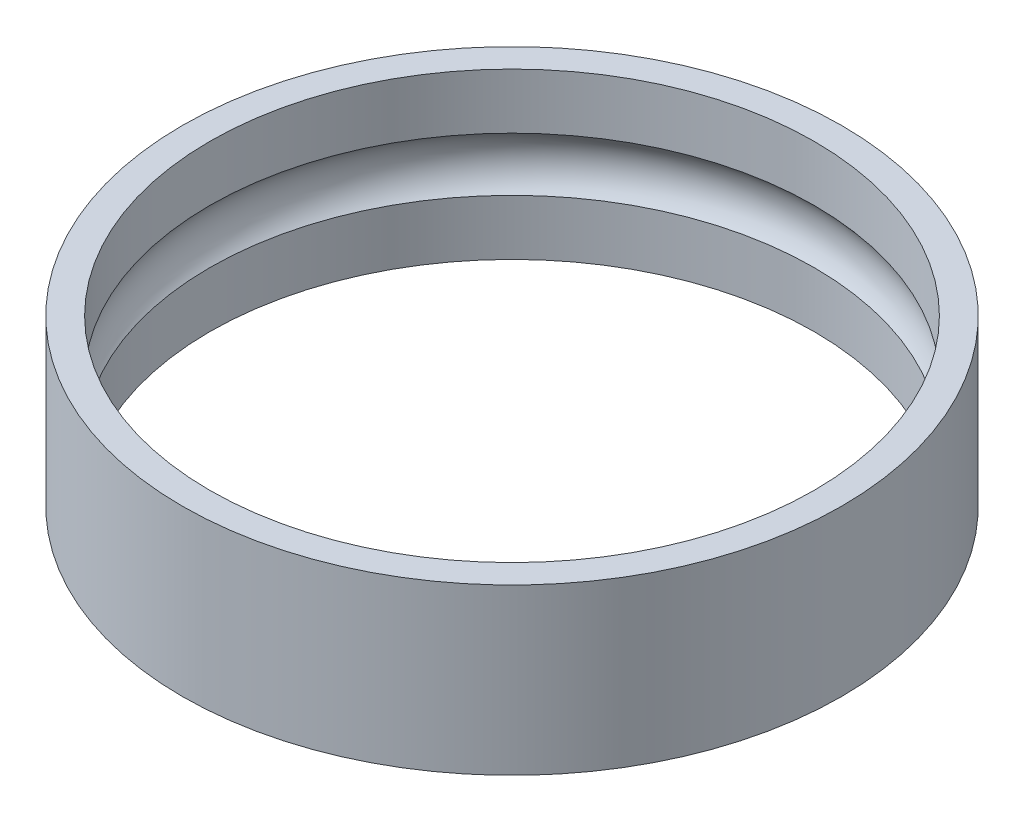
ISO-10303-21;
HEADER;
FILE_DESCRIPTION(('STEP AP214'),'2;1');
FILE_NAME('part.step','',(''),(''),'','','');
FILE_SCHEMA(('AUTOMOTIVE_DESIGN { 1 0 10303 214 1 1 1 1 }'));
ENDSEC;
DATA;
#1=APPLICATION_CONTEXT('core data for automotive mechanical design processes');
#2=APPLICATION_PROTOCOL_DEFINITION('international standard','automotive_design',2000,#1);
#3=PRODUCT_CONTEXT('',#1,'mechanical');
#4=PRODUCT('Part','Part','',(#3));
#5=PRODUCT_RELATED_PRODUCT_CATEGORY('part','',(#4));
#6=PRODUCT_DEFINITION_FORMATION('','',#4);
#7=PRODUCT_DEFINITION_CONTEXT('part definition',#1,'design');
#8=PRODUCT_DEFINITION('design','',#6,#7);
#9=PRODUCT_DEFINITION_SHAPE('','',#8);
#10=(LENGTH_UNIT() NAMED_UNIT(*) SI_UNIT(.MILLI.,.METRE.));
#11=(NAMED_UNIT(*) PLANE_ANGLE_UNIT() SI_UNIT($,.RADIAN.));
#12=(NAMED_UNIT(*) SI_UNIT($,.STERADIAN.) SOLID_ANGLE_UNIT());
#13=UNCERTAINTY_MEASURE_WITH_UNIT(LENGTH_MEASURE(1.E-05),#10,'distance_accuracy_value','');
#14=(GEOMETRIC_REPRESENTATION_CONTEXT(3) GLOBAL_UNCERTAINTY_ASSIGNED_CONTEXT((#13)) GLOBAL_UNIT_ASSIGNED_CONTEXT((#10,
#11,#12)) REPRESENTATION_CONTEXT('',''));
#15=CARTESIAN_POINT('',(0.,0.,0.));
#16=DIRECTION('',(0.,0.,1.));
#17=DIRECTION('',(1.,0.,0.));
#18=AXIS2_PLACEMENT_3D('',#15,#16,#17);
#19=CARTESIAN_POINT('',(0.,1.5,0.));
#20=DIRECTION('',(0.,-1.,0.));
#21=DIRECTION('',(0.,0.,-1.));
#22=AXIS2_PLACEMENT_3D('',#19,#20,#21);
#23=CYLINDRICAL_SURFACE('',#22,5.5);
#24=CARTESIAN_POINT('',(0.,1.5,0.));
#25=DIRECTION('',(0.,1.,0.));
#26=DIRECTION('',(0.,0.,1.));
#27=AXIS2_PLACEMENT_3D('',#24,#25,#26);
#28=CIRCLE('',#27,5.5);
#29=CARTESIAN_POINT('',(0.,1.5,5.5));
#30=VERTEX_POINT('',#29);
#31=EDGE_CURVE('E54',#30,#30,#28,.T.);
#32=ORIENTED_EDGE('',*,*,#31,.T.);
#33=EDGE_LOOP('',(#32));
#34=FACE_BOUND('',#33,.T.);
#35=CARTESIAN_POINT('',(0.,0.489897948556634,0.));
#36=DIRECTION('',(0.,-1.,0.));
#37=DIRECTION('',(0.,0.,-1.));
#38=AXIS2_PLACEMENT_3D('',#35,#36,#37);
#39=CIRCLE('',#38,5.5);
#40=CARTESIAN_POINT('',(0.,0.489897948556634,-5.5));
#41=VERTEX_POINT('',#40);
#42=EDGE_CURVE('E43',#41,#41,#39,.T.);
#43=ORIENTED_EDGE('',*,*,#42,.T.);
#44=EDGE_LOOP('',(#43));
#45=FACE_BOUND('',#44,.T.);
#46=ADVANCED_FACE('F39',(#34,#45),#23,.F.);
#47=CARTESIAN_POINT('',(0.,-1.5,0.));
#48=DIRECTION('',(0.,1.,0.));
#49=DIRECTION('',(0.,0.,1.));
#50=AXIS2_PLACEMENT_3D('',#47,#48,#49);
#51=CIRCLE('',#50,5.5);
#52=CARTESIAN_POINT('',(0.,-1.5,5.5));
#53=VERTEX_POINT('',#52);
#54=EDGE_CURVE('E57',#53,#53,#51,.T.);
#55=ORIENTED_EDGE('',*,*,#54,.F.);
#56=EDGE_LOOP('',(#55));
#57=FACE_BOUND('',#56,.T.);
#58=CARTESIAN_POINT('',(0.,-0.489897948556634,0.));
#59=DIRECTION('',(0.,1.,0.));
#60=DIRECTION('',(0.,0.,1.));
#61=AXIS2_PLACEMENT_3D('',#58,#59,#60);
#62=CIRCLE('',#61,5.5);
#63=CARTESIAN_POINT('',(0.,-0.489897948556634,5.5));
#64=VERTEX_POINT('',#63);
#65=EDGE_CURVE('E59',#64,#64,#62,.T.);
#66=ORIENTED_EDGE('',*,*,#65,.T.);
#67=EDGE_LOOP('',(#66));
#68=FACE_BOUND('',#67,.T.);
#69=ADVANCED_FACE('F80',(#57,#68),#23,.F.);
#70=CARTESIAN_POINT('',(0.,1.5,0.));
#71=DIRECTION('',(0.,1.,0.));
#72=DIRECTION('',(0.,0.,1.));
#73=AXIS2_PLACEMENT_3D('',#70,#71,#72);
#74=PLANE('',#73);
#75=CARTESIAN_POINT('',(0.,1.5,0.));
#76=DIRECTION('',(0.,1.,0.));
#77=DIRECTION('',(0.,0.,1.));
#78=AXIS2_PLACEMENT_3D('',#75,#76,#77);
#79=CIRCLE('',#78,6.);
#80=CARTESIAN_POINT('',(0.,1.5,6.));
#81=VERTEX_POINT('',#80);
#82=EDGE_CURVE('E10',#81,#81,#79,.T.);
#83=ORIENTED_EDGE('',*,*,#82,.T.);
#84=EDGE_LOOP('',(#83));
#85=FACE_BOUND('',#84,.T.);
#86=ORIENTED_EDGE('',*,*,#31,.F.);
#87=EDGE_LOOP('',(#86));
#88=FACE_BOUND('',#87,.T.);
#89=ADVANCED_FACE('F77',(#85,#88),#74,.T.);
#90=CARTESIAN_POINT('',(0.,-1.5,0.));
#91=DIRECTION('',(0.,1.,0.));
#92=DIRECTION('',(0.,0.,1.));
#93=AXIS2_PLACEMENT_3D('',#90,#91,#92);
#94=PLANE('',#93);
#95=CARTESIAN_POINT('',(0.,-1.5,0.));
#96=DIRECTION('',(0.,1.,0.));
#97=DIRECTION('',(0.,0.,1.));
#98=AXIS2_PLACEMENT_3D('',#95,#96,#97);
#99=CIRCLE('',#98,6.);
#100=CARTESIAN_POINT('',(0.,-1.5,6.));
#101=VERTEX_POINT('',#100);
#102=EDGE_CURVE('E48',#101,#101,#99,.T.);
#103=ORIENTED_EDGE('',*,*,#102,.F.);
#104=EDGE_LOOP('',(#103));
#105=FACE_BOUND('',#104,.T.);
#106=ORIENTED_EDGE('',*,*,#54,.T.);
#107=EDGE_LOOP('',(#106));
#108=FACE_BOUND('',#107,.T.);
#109=ADVANCED_FACE('F79',(#105,#108),#94,.F.);
#110=CARTESIAN_POINT('',(0.,1.5,0.));
#111=DIRECTION('',(0.,-1.,0.));
#112=DIRECTION('',(0.,0.,-1.));
#113=AXIS2_PLACEMENT_3D('',#110,#111,#112);
#114=CYLINDRICAL_SURFACE('',#113,6.);
#115=ORIENTED_EDGE('',*,*,#82,.F.);
#116=EDGE_LOOP('',(#115));
#117=FACE_BOUND('',#116,.T.);
#118=ORIENTED_EDGE('',*,*,#102,.T.);
#119=EDGE_LOOP('',(#118));
#120=FACE_BOUND('',#119,.T.);
#121=ADVANCED_FACE('F41',(#117,#120),#114,.T.);
#122=CARTESIAN_POINT('',(0.,0.,0.));
#123=DIRECTION('',(0.,1.,0.));
#124=DIRECTION('',(0.,0.,1.));
#125=AXIS2_PLACEMENT_3D('',#122,#123,#124);
#126=TOROIDAL_SURFACE('',#125,5.,0.7);
#127=ORIENTED_EDGE('',*,*,#42,.F.);
#128=EDGE_LOOP('',(#127));
#129=FACE_BOUND('',#128,.T.);
#130=ORIENTED_EDGE('',*,*,#65,.F.);
#131=EDGE_LOOP('',(#130));
#132=FACE_BOUND('',#131,.T.);
#133=ADVANCED_FACE('F93',(#129,#132),#126,.F.);
#134=CLOSED_SHELL('',(#46,#69,#89,#109,#121,#133));
#135=MANIFOLD_SOLID_BREP('B2',#134);
#136=ADVANCED_BREP_SHAPE_REPRESENTATION('',(#18,#135),#14);
#137=SHAPE_DEFINITION_REPRESENTATION(#9,#136);
ENDSEC;
END-ISO-10303-21;
